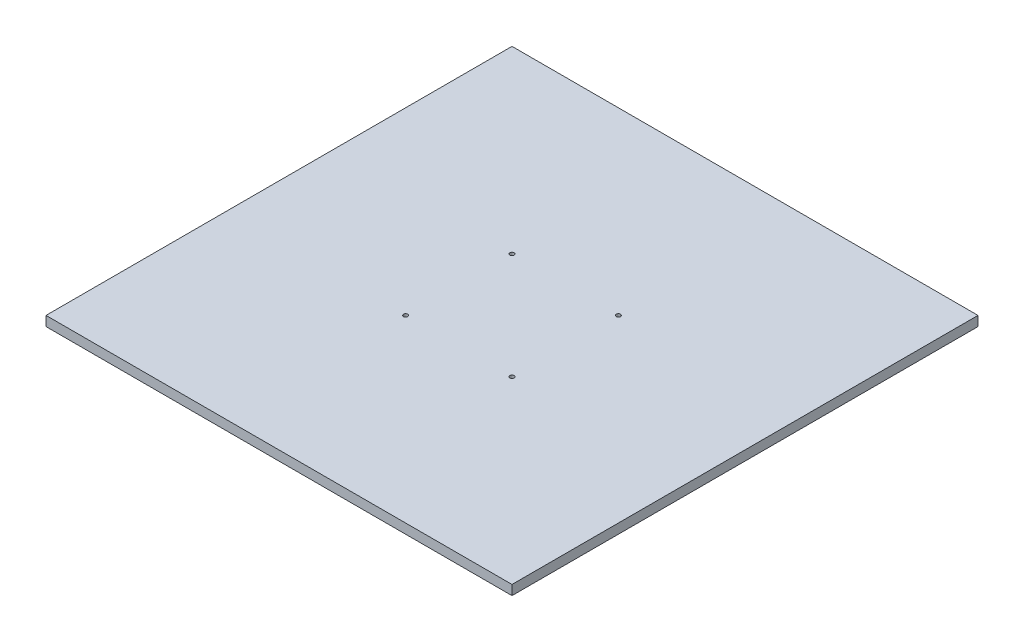
ISO-10303-21;
HEADER;
FILE_DESCRIPTION(('STEP AP214'),'2;1');
FILE_NAME('part.step','',(''),(''),'','','');
FILE_SCHEMA(('AUTOMOTIVE_DESIGN { 1 0 10303 214 1 1 1 1 }'));
ENDSEC;
DATA;
#1=APPLICATION_CONTEXT('core data for automotive mechanical design processes');
#2=APPLICATION_PROTOCOL_DEFINITION('international standard','automotive_design',2000,#1);
#3=PRODUCT_CONTEXT('',#1,'mechanical');
#4=PRODUCT('Part','Part','',(#3));
#5=PRODUCT_RELATED_PRODUCT_CATEGORY('part','',(#4));
#6=PRODUCT_DEFINITION_FORMATION('','',#4);
#7=PRODUCT_DEFINITION_CONTEXT('part definition',#1,'design');
#8=PRODUCT_DEFINITION('design','',#6,#7);
#9=PRODUCT_DEFINITION_SHAPE('','',#8);
#10=(LENGTH_UNIT() NAMED_UNIT(*) SI_UNIT(.MILLI.,.METRE.));
#11=(NAMED_UNIT(*) PLANE_ANGLE_UNIT() SI_UNIT($,.RADIAN.));
#12=(NAMED_UNIT(*) SI_UNIT($,.STERADIAN.) SOLID_ANGLE_UNIT());
#13=UNCERTAINTY_MEASURE_WITH_UNIT(LENGTH_MEASURE(1.E-05),#10,'distance_accuracy_value','');
#14=(GEOMETRIC_REPRESENTATION_CONTEXT(3) GLOBAL_UNCERTAINTY_ASSIGNED_CONTEXT((#13)) GLOBAL_UNIT_ASSIGNED_CONTEXT((#10,
#11,#12)) REPRESENTATION_CONTEXT('',''));
#15=CARTESIAN_POINT('',(0.,0.,0.));
#16=DIRECTION('',(0.,0.,1.));
#17=DIRECTION('',(1.,0.,0.));
#18=AXIS2_PLACEMENT_3D('',#15,#16,#17);
#19=CARTESIAN_POINT('',(0.,12.7,0.));
#20=DIRECTION('',(0.,1.,0.));
#21=DIRECTION('',(0.,0.,1.));
#22=AXIS2_PLACEMENT_3D('',#19,#20,#21);
#23=PLANE('',#22);
#24=CARTESIAN_POINT('',(-69.596984938286,12.7,-69.5969849382859));
#25=DIRECTION('',(0.,1.,0.));
#26=DIRECTION('',(0.,0.,1.));
#27=AXIS2_PLACEMENT_3D('',#24,#25,#26);
#28=CIRCLE('',#27,2.79400000000001);
#29=CARTESIAN_POINT('',(-69.596984938286,12.7,-66.8029849382859));
#30=VERTEX_POINT('',#29);
#31=EDGE_CURVE('E121',#30,#30,#28,.T.);
#32=ORIENTED_EDGE('',*,*,#31,.F.);
#33=EDGE_LOOP('',(#32));
#34=FACE_BOUND('',#33,.T.);
#35=CARTESIAN_POINT('',(-69.596984938286,12.7,69.596984938286));
#36=DIRECTION('',(0.,1.,0.));
#37=DIRECTION('',(0.,0.,1.));
#38=AXIS2_PLACEMENT_3D('',#35,#36,#37);
#39=CIRCLE('',#38,2.79400000000001);
#40=CARTESIAN_POINT('',(-69.596984938286,12.7,72.390984938286));
#41=VERTEX_POINT('',#40);
#42=EDGE_CURVE('E100',#41,#41,#39,.T.);
#43=ORIENTED_EDGE('',*,*,#42,.F.);
#44=EDGE_LOOP('',(#43));
#45=FACE_BOUND('',#44,.T.);
#46=DIRECTION('',(0.,0.,1.));
#47=VECTOR('',#46,1.);
#48=CARTESIAN_POINT('',(-304.8,12.7,304.8));
#49=LINE('',#48,#47);
#50=CARTESIAN_POINT('',(-304.8,12.7,-304.8));
#51=VERTEX_POINT('',#50);
#52=CARTESIAN_POINT('',(-304.8,12.7,304.8));
#53=VERTEX_POINT('',#52);
#54=EDGE_CURVE('E85',#51,#53,#49,.T.);
#55=ORIENTED_EDGE('',*,*,#54,.T.);
#56=DIRECTION('',(1.,0.,0.));
#57=VECTOR('',#56,1.);
#58=CARTESIAN_POINT('',(304.8,12.7,304.8));
#59=LINE('',#58,#57);
#60=CARTESIAN_POINT('',(304.8,12.7,304.8));
#61=VERTEX_POINT('',#60);
#62=EDGE_CURVE('E80',#53,#61,#59,.T.);
#63=ORIENTED_EDGE('',*,*,#62,.T.);
#64=DIRECTION('',(0.,0.,-1.));
#65=VECTOR('',#64,1.);
#66=CARTESIAN_POINT('',(304.8,12.7,304.8));
#67=LINE('',#66,#65);
#68=CARTESIAN_POINT('',(304.8,12.7,-304.8));
#69=VERTEX_POINT('',#68);
#70=EDGE_CURVE('E83',#61,#69,#67,.T.);
#71=ORIENTED_EDGE('',*,*,#70,.T.);
#72=DIRECTION('',(-1.,0.,0.));
#73=VECTOR('',#72,1.);
#74=CARTESIAN_POINT('',(304.8,12.7,-304.8));
#75=LINE('',#74,#73);
#76=EDGE_CURVE('E50',#69,#51,#75,.T.);
#77=ORIENTED_EDGE('',*,*,#76,.T.);
#78=EDGE_LOOP('',(#55,#63,#71,#77));
#79=FACE_BOUND('',#78,.T.);
#80=CARTESIAN_POINT('',(69.5969849382859,12.7,69.596984938286));
#81=DIRECTION('',(0.,1.,0.));
#82=DIRECTION('',(0.,0.,1.));
#83=AXIS2_PLACEMENT_3D('',#80,#81,#82);
#84=CIRCLE('',#83,2.79400000000001);
#85=CARTESIAN_POINT('',(69.5969849382859,12.7,72.390984938286));
#86=VERTEX_POINT('',#85);
#87=EDGE_CURVE('E115',#86,#86,#84,.T.);
#88=ORIENTED_EDGE('',*,*,#87,.F.);
#89=EDGE_LOOP('',(#88));
#90=FACE_BOUND('',#89,.T.);
#91=CARTESIAN_POINT('',(69.5969849382859,12.7,-69.5969849382859));
#92=DIRECTION('',(0.,1.,0.));
#93=DIRECTION('',(0.,0.,1.));
#94=AXIS2_PLACEMENT_3D('',#91,#92,#93);
#95=CIRCLE('',#94,2.79400000000001);
#96=CARTESIAN_POINT('',(69.5969849382859,12.7,-66.8029849382859));
#97=VERTEX_POINT('',#96);
#98=EDGE_CURVE('E127',#97,#97,#95,.T.);
#99=ORIENTED_EDGE('',*,*,#98,.F.);
#100=EDGE_LOOP('',(#99));
#101=FACE_BOUND('',#100,.T.);
#102=ADVANCED_FACE('F33',(#34,#45,#79,#90,#101),#23,.T.);
#103=CARTESIAN_POINT('',(0.,0.,0.));
#104=DIRECTION('',(0.,1.,0.));
#105=DIRECTION('',(0.,0.,1.));
#106=AXIS2_PLACEMENT_3D('',#103,#104,#105);
#107=PLANE('',#106);
#108=DIRECTION('',(0.,0.,1.));
#109=VECTOR('',#108,1.);
#110=CARTESIAN_POINT('',(-304.8,0.,304.8));
#111=LINE('',#110,#109);
#112=CARTESIAN_POINT('',(-304.8,0.,-304.8));
#113=VERTEX_POINT('',#112);
#114=CARTESIAN_POINT('',(-304.8,0.,304.8));
#115=VERTEX_POINT('',#114);
#116=EDGE_CURVE('E97',#113,#115,#111,.T.);
#117=ORIENTED_EDGE('',*,*,#116,.F.);
#118=DIRECTION('',(-1.,0.,0.));
#119=VECTOR('',#118,1.);
#120=CARTESIAN_POINT('',(304.8,0.,-304.8));
#121=LINE('',#120,#119);
#122=CARTESIAN_POINT('',(304.8,0.,-304.8));
#123=VERTEX_POINT('',#122);
#124=EDGE_CURVE('E73',#123,#113,#121,.T.);
#125=ORIENTED_EDGE('',*,*,#124,.F.);
#126=DIRECTION('',(0.,0.,-1.));
#127=VECTOR('',#126,1.);
#128=CARTESIAN_POINT('',(304.8,0.,304.8));
#129=LINE('',#128,#127);
#130=CARTESIAN_POINT('',(304.8,0.,304.8));
#131=VERTEX_POINT('',#130);
#132=EDGE_CURVE('E67',#131,#123,#129,.T.);
#133=ORIENTED_EDGE('',*,*,#132,.F.);
#134=DIRECTION('',(1.,0.,0.));
#135=VECTOR('',#134,1.);
#136=CARTESIAN_POINT('',(304.8,0.,304.8));
#137=LINE('',#136,#135);
#138=EDGE_CURVE('E89',#115,#131,#137,.T.);
#139=ORIENTED_EDGE('',*,*,#138,.F.);
#140=EDGE_LOOP('',(#117,#125,#133,#139));
#141=FACE_BOUND('',#140,.T.);
#142=CARTESIAN_POINT('',(-69.596984938286,0.,69.596984938286));
#143=DIRECTION('',(0.,1.,0.));
#144=DIRECTION('',(0.,0.,1.));
#145=AXIS2_PLACEMENT_3D('',#142,#143,#144);
#146=CIRCLE('',#145,2.79400000000001);
#147=CARTESIAN_POINT('',(-69.596984938286,0.,72.390984938286));
#148=VERTEX_POINT('',#147);
#149=EDGE_CURVE('E112',#148,#148,#146,.T.);
#150=ORIENTED_EDGE('',*,*,#149,.T.);
#151=EDGE_LOOP('',(#150));
#152=FACE_BOUND('',#151,.T.);
#153=CARTESIAN_POINT('',(69.5969849382859,0.,69.596984938286));
#154=DIRECTION('',(0.,1.,0.));
#155=DIRECTION('',(0.,0.,1.));
#156=AXIS2_PLACEMENT_3D('',#153,#154,#155);
#157=CIRCLE('',#156,2.79400000000001);
#158=CARTESIAN_POINT('',(69.5969849382859,0.,72.390984938286));
#159=VERTEX_POINT('',#158);
#160=EDGE_CURVE('E118',#159,#159,#157,.T.);
#161=ORIENTED_EDGE('',*,*,#160,.T.);
#162=EDGE_LOOP('',(#161));
#163=FACE_BOUND('',#162,.T.);
#164=CARTESIAN_POINT('',(-69.596984938286,0.,-69.5969849382859));
#165=DIRECTION('',(0.,1.,0.));
#166=DIRECTION('',(0.,0.,1.));
#167=AXIS2_PLACEMENT_3D('',#164,#165,#166);
#168=CIRCLE('',#167,2.79400000000001);
#169=CARTESIAN_POINT('',(-69.596984938286,0.,-66.8029849382859));
#170=VERTEX_POINT('',#169);
#171=EDGE_CURVE('E124',#170,#170,#168,.T.);
#172=ORIENTED_EDGE('',*,*,#171,.T.);
#173=EDGE_LOOP('',(#172));
#174=FACE_BOUND('',#173,.T.);
#175=CARTESIAN_POINT('',(69.5969849382859,0.,-69.5969849382859));
#176=DIRECTION('',(0.,1.,0.));
#177=DIRECTION('',(0.,0.,1.));
#178=AXIS2_PLACEMENT_3D('',#175,#176,#177);
#179=CIRCLE('',#178,2.79400000000001);
#180=CARTESIAN_POINT('',(69.5969849382859,0.,-66.8029849382859));
#181=VERTEX_POINT('',#180);
#182=EDGE_CURVE('E130',#181,#181,#179,.T.);
#183=ORIENTED_EDGE('',*,*,#182,.T.);
#184=EDGE_LOOP('',(#183));
#185=FACE_BOUND('',#184,.T.);
#186=ADVANCED_FACE('F108',(#141,#152,#163,#174,#185),#107,.F.);
#187=CARTESIAN_POINT('',(-304.8,12.7,304.8));
#188=DIRECTION('',(1.,0.,0.));
#189=DIRECTION('',(0.,0.,-1.));
#190=AXIS2_PLACEMENT_3D('',#187,#188,#189);
#191=PLANE('',#190);
#192=ORIENTED_EDGE('',*,*,#116,.T.);
#193=DIRECTION('',(0.,-1.,0.));
#194=VECTOR('',#193,1.);
#195=CARTESIAN_POINT('',(-304.8,12.7,304.8));
#196=LINE('',#195,#194);
#197=EDGE_CURVE('E11',#53,#115,#196,.T.);
#198=ORIENTED_EDGE('',*,*,#197,.F.);
#199=ORIENTED_EDGE('',*,*,#54,.F.);
#200=DIRECTION('',(0.,-1.,0.));
#201=VECTOR('',#200,1.);
#202=CARTESIAN_POINT('',(-304.8,12.7,-304.8));
#203=LINE('',#202,#201);
#204=EDGE_CURVE('E93',#51,#113,#203,.T.);
#205=ORIENTED_EDGE('',*,*,#204,.T.);
#206=EDGE_LOOP('',(#192,#198,#199,#205));
#207=FACE_BOUND('',#206,.T.);
#208=ADVANCED_FACE('F35',(#207),#191,.F.);
#209=CARTESIAN_POINT('',(304.8,12.7,304.8));
#210=DIRECTION('',(0.,0.,-1.));
#211=DIRECTION('',(-1.,0.,0.));
#212=AXIS2_PLACEMENT_3D('',#209,#210,#211);
#213=PLANE('',#212);
#214=ORIENTED_EDGE('',*,*,#138,.T.);
#215=DIRECTION('',(0.,-1.,0.));
#216=VECTOR('',#215,1.);
#217=CARTESIAN_POINT('',(304.8,12.7,304.8));
#218=LINE('',#217,#216);
#219=EDGE_CURVE('E42',#61,#131,#218,.T.);
#220=ORIENTED_EDGE('',*,*,#219,.F.);
#221=ORIENTED_EDGE('',*,*,#62,.F.);
#222=ORIENTED_EDGE('',*,*,#197,.T.);
#223=EDGE_LOOP('',(#214,#220,#221,#222));
#224=FACE_BOUND('',#223,.T.);
#225=ADVANCED_FACE('F88',(#224),#213,.F.);
#226=CARTESIAN_POINT('',(304.8,12.7,304.8));
#227=DIRECTION('',(-1.,0.,0.));
#228=DIRECTION('',(0.,0.,1.));
#229=AXIS2_PLACEMENT_3D('',#226,#227,#228);
#230=PLANE('',#229);
#231=ORIENTED_EDGE('',*,*,#132,.T.);
#232=DIRECTION('',(0.,-1.,0.));
#233=VECTOR('',#232,1.);
#234=CARTESIAN_POINT('',(304.8,12.7,-304.8));
#235=LINE('',#234,#233);
#236=EDGE_CURVE('E90',#69,#123,#235,.T.);
#237=ORIENTED_EDGE('',*,*,#236,.F.);
#238=ORIENTED_EDGE('',*,*,#70,.F.);
#239=ORIENTED_EDGE('',*,*,#219,.T.);
#240=EDGE_LOOP('',(#231,#237,#238,#239));
#241=FACE_BOUND('',#240,.T.);
#242=ADVANCED_FACE('F91',(#241),#230,.F.);
#243=CARTESIAN_POINT('',(304.8,12.7,-304.8));
#244=DIRECTION('',(0.,0.,1.));
#245=DIRECTION('',(1.,0.,0.));
#246=AXIS2_PLACEMENT_3D('',#243,#244,#245);
#247=PLANE('',#246);
#248=ORIENTED_EDGE('',*,*,#124,.T.);
#249=ORIENTED_EDGE('',*,*,#204,.F.);
#250=ORIENTED_EDGE('',*,*,#76,.F.);
#251=ORIENTED_EDGE('',*,*,#236,.T.);
#252=EDGE_LOOP('',(#248,#249,#250,#251));
#253=FACE_BOUND('',#252,.T.);
#254=ADVANCED_FACE('F105',(#253),#247,.F.);
#255=CARTESIAN_POINT('',(-69.596984938286,12.7,69.596984938286));
#256=DIRECTION('',(0.,-1.,0.));
#257=DIRECTION('',(0.,0.,-1.));
#258=AXIS2_PLACEMENT_3D('',#255,#256,#257);
#259=CYLINDRICAL_SURFACE('',#258,2.79400000000001);
#260=ORIENTED_EDGE('',*,*,#42,.T.);
#261=EDGE_LOOP('',(#260));
#262=FACE_BOUND('',#261,.T.);
#263=ORIENTED_EDGE('',*,*,#149,.F.);
#264=EDGE_LOOP('',(#263));
#265=FACE_BOUND('',#264,.T.);
#266=ADVANCED_FACE('F149',(#262,#265),#259,.F.);
#267=CARTESIAN_POINT('',(69.5969849382859,12.7,69.596984938286));
#268=DIRECTION('',(0.,-1.,0.));
#269=DIRECTION('',(0.,0.,-1.));
#270=AXIS2_PLACEMENT_3D('',#267,#268,#269);
#271=CYLINDRICAL_SURFACE('',#270,2.79400000000001);
#272=ORIENTED_EDGE('',*,*,#87,.T.);
#273=EDGE_LOOP('',(#272));
#274=FACE_BOUND('',#273,.T.);
#275=ORIENTED_EDGE('',*,*,#160,.F.);
#276=EDGE_LOOP('',(#275));
#277=FACE_BOUND('',#276,.T.);
#278=ADVANCED_FACE('F195',(#274,#277),#271,.F.);
#279=CARTESIAN_POINT('',(-69.596984938286,12.7,-69.5969849382859));
#280=DIRECTION('',(0.,-1.,0.));
#281=DIRECTION('',(0.,0.,-1.));
#282=AXIS2_PLACEMENT_3D('',#279,#280,#281);
#283=CYLINDRICAL_SURFACE('',#282,2.79400000000001);
#284=ORIENTED_EDGE('',*,*,#31,.T.);
#285=EDGE_LOOP('',(#284));
#286=FACE_BOUND('',#285,.T.);
#287=ORIENTED_EDGE('',*,*,#171,.F.);
#288=EDGE_LOOP('',(#287));
#289=FACE_BOUND('',#288,.T.);
#290=ADVANCED_FACE('F203',(#286,#289),#283,.F.);
#291=CARTESIAN_POINT('',(69.5969849382859,12.7,-69.5969849382859));
#292=DIRECTION('',(0.,-1.,0.));
#293=DIRECTION('',(0.,0.,-1.));
#294=AXIS2_PLACEMENT_3D('',#291,#292,#293);
#295=CYLINDRICAL_SURFACE('',#294,2.79400000000001);
#296=ORIENTED_EDGE('',*,*,#98,.T.);
#297=EDGE_LOOP('',(#296));
#298=FACE_BOUND('',#297,.T.);
#299=ORIENTED_EDGE('',*,*,#182,.F.);
#300=EDGE_LOOP('',(#299));
#301=FACE_BOUND('',#300,.T.);
#302=ADVANCED_FACE('F136',(#298,#301),#295,.F.);
#303=CLOSED_SHELL('',(#102,#186,#208,#225,#242,#254,#266,#278,#290,#302));
#304=MANIFOLD_SOLID_BREP('B2',#303);
#305=ADVANCED_BREP_SHAPE_REPRESENTATION('',(#18,#304),#14);
#306=SHAPE_DEFINITION_REPRESENTATION(#9,#305);
ENDSEC;
END-ISO-10303-21;
